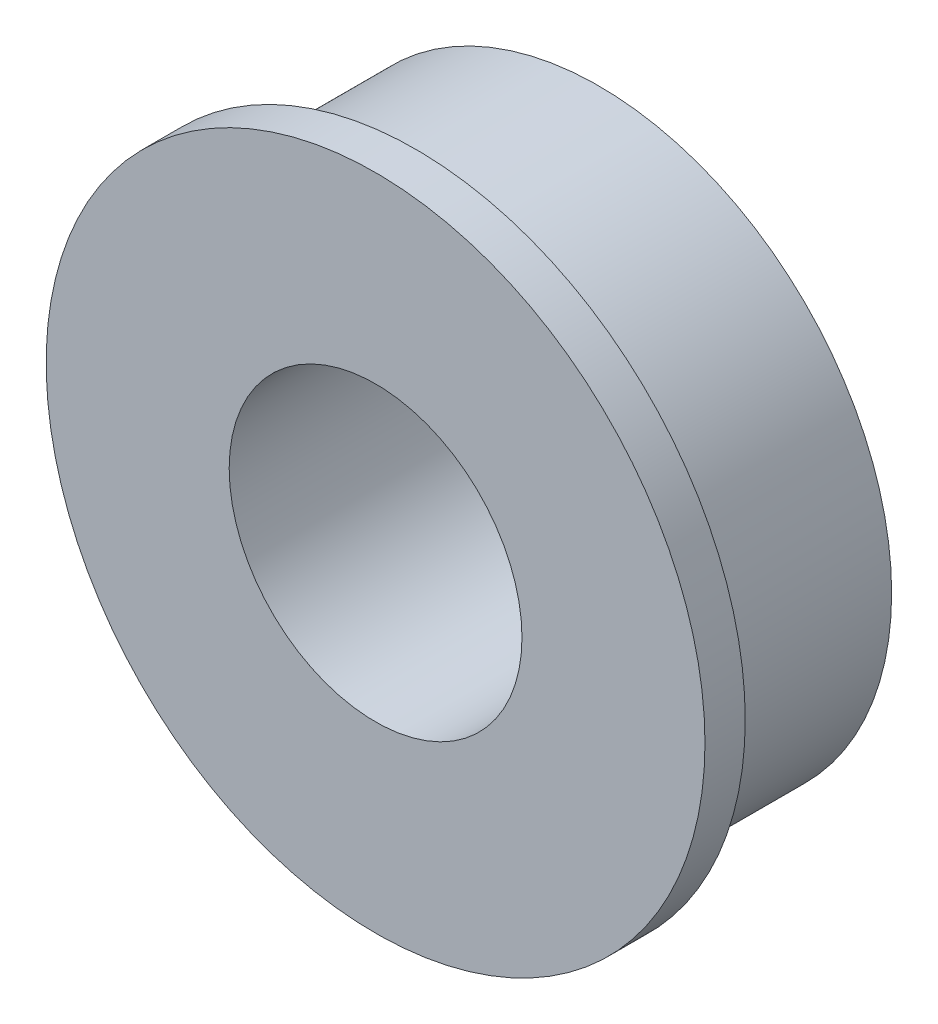
ISO-10303-21;
HEADER;
FILE_DESCRIPTION(('STEP AP214'),'2;1');
FILE_NAME('part.step','',(''),(''),'','','');
FILE_SCHEMA(('AUTOMOTIVE_DESIGN { 1 0 10303 214 1 1 1 1 }'));
ENDSEC;
DATA;
#1=APPLICATION_CONTEXT('core data for automotive mechanical design processes');
#2=APPLICATION_PROTOCOL_DEFINITION('international standard','automotive_design',2000,#1);
#3=PRODUCT_CONTEXT('',#1,'mechanical');
#4=PRODUCT('Part','Part','',(#3));
#5=PRODUCT_RELATED_PRODUCT_CATEGORY('part','',(#4));
#6=PRODUCT_DEFINITION_FORMATION('','',#4);
#7=PRODUCT_DEFINITION_CONTEXT('part definition',#1,'design');
#8=PRODUCT_DEFINITION('design','',#6,#7);
#9=PRODUCT_DEFINITION_SHAPE('','',#8);
#10=(LENGTH_UNIT() NAMED_UNIT(*) SI_UNIT(.MILLI.,.METRE.));
#11=(NAMED_UNIT(*) PLANE_ANGLE_UNIT() SI_UNIT($,.RADIAN.));
#12=(NAMED_UNIT(*) SI_UNIT($,.STERADIAN.) SOLID_ANGLE_UNIT());
#13=UNCERTAINTY_MEASURE_WITH_UNIT(LENGTH_MEASURE(1.E-05),#10,'distance_accuracy_value','');
#14=(GEOMETRIC_REPRESENTATION_CONTEXT(3) GLOBAL_UNCERTAINTY_ASSIGNED_CONTEXT((#13)) GLOBAL_UNIT_ASSIGNED_CONTEXT((#10,
#11,#12)) REPRESENTATION_CONTEXT('',''));
#15=CARTESIAN_POINT('',(0.,0.,0.));
#16=DIRECTION('',(0.,0.,1.));
#17=DIRECTION('',(1.,0.,0.));
#18=AXIS2_PLACEMENT_3D('',#15,#16,#17);
#19=CARTESIAN_POINT('',(0.,0.,0.));
#20=DIRECTION('',(0.,0.,1.));
#21=DIRECTION('',(1.,0.,0.));
#22=AXIS2_PLACEMENT_3D('',#19,#20,#21);
#23=PLANE('',#22);
#24=CARTESIAN_POINT('',(0.,0.,0.));
#25=DIRECTION('',(0.,0.,1.));
#26=DIRECTION('',(1.,0.,0.));
#27=AXIS2_PLACEMENT_3D('',#24,#25,#26);
#28=CIRCLE('',#27,8.);
#29=CARTESIAN_POINT('',(8.,0.,0.));
#30=VERTEX_POINT('',#29);
#31=EDGE_CURVE('E45',#30,#30,#28,.T.);
#32=ORIENTED_EDGE('',*,*,#31,.F.);
#33=EDGE_LOOP('',(#32));
#34=FACE_BOUND('',#33,.T.);
#35=CARTESIAN_POINT('',(0.,0.,0.));
#36=DIRECTION('',(0.,0.,1.));
#37=DIRECTION('',(1.,0.,0.));
#38=AXIS2_PLACEMENT_3D('',#35,#36,#37);
#39=CIRCLE('',#38,4.);
#40=CARTESIAN_POINT('',(4.,0.,0.));
#41=VERTEX_POINT('',#40);
#42=EDGE_CURVE('E54',#41,#41,#39,.T.);
#43=ORIENTED_EDGE('',*,*,#42,.T.);
#44=EDGE_LOOP('',(#43));
#45=FACE_BOUND('',#44,.T.);
#46=ADVANCED_FACE('F41',(#34,#45),#23,.F.);
#47=CARTESIAN_POINT('',(0.,0.,5.));
#48=DIRECTION('',(0.,0.,-1.));
#49=DIRECTION('',(-1.,0.,0.));
#50=AXIS2_PLACEMENT_3D('',#47,#48,#49);
#51=CYLINDRICAL_SURFACE('',#50,8.);
#52=CARTESIAN_POINT('',(0.,0.,5.));
#53=DIRECTION('',(0.,0.,1.));
#54=DIRECTION('',(1.,0.,0.));
#55=AXIS2_PLACEMENT_3D('',#52,#53,#54);
#56=CIRCLE('',#55,8.);
#57=CARTESIAN_POINT('',(8.,0.,5.));
#58=VERTEX_POINT('',#57);
#59=EDGE_CURVE('E10',#58,#58,#56,.T.);
#60=ORIENTED_EDGE('',*,*,#59,.F.);
#61=EDGE_LOOP('',(#60));
#62=FACE_BOUND('',#61,.T.);
#63=ORIENTED_EDGE('',*,*,#31,.T.);
#64=EDGE_LOOP('',(#63));
#65=FACE_BOUND('',#64,.T.);
#66=ADVANCED_FACE('F43',(#62,#65),#51,.T.);
#67=CARTESIAN_POINT('',(0.,0.,5.));
#68=DIRECTION('',(0.,0.,-1.));
#69=DIRECTION('',(-1.,0.,0.));
#70=AXIS2_PLACEMENT_3D('',#67,#68,#69);
#71=CYLINDRICAL_SURFACE('',#70,4.);
#72=ORIENTED_EDGE('',*,*,#42,.F.);
#73=EDGE_LOOP('',(#72));
#74=FACE_BOUND('',#73,.T.);
#75=CARTESIAN_POINT('',(0.,0.,6.1));
#76=DIRECTION('',(0.,0.,1.));
#77=DIRECTION('',(1.,0.,0.));
#78=AXIS2_PLACEMENT_3D('',#75,#76,#77);
#79=CIRCLE('',#78,4.);
#80=CARTESIAN_POINT('',(4.,0.,6.1));
#81=VERTEX_POINT('',#80);
#82=EDGE_CURVE('E64',#81,#81,#79,.T.);
#83=ORIENTED_EDGE('',*,*,#82,.T.);
#84=EDGE_LOOP('',(#83));
#85=FACE_BOUND('',#84,.T.);
#86=ADVANCED_FACE('F72',(#74,#85),#71,.F.);
#87=CARTESIAN_POINT('',(0.,0.,6.1));
#88=DIRECTION('',(0.,0.,1.));
#89=DIRECTION('',(1.,0.,0.));
#90=AXIS2_PLACEMENT_3D('',#87,#88,#89);
#91=PLANE('',#90);
#92=CARTESIAN_POINT('',(0.,0.,6.1));
#93=DIRECTION('',(0.,0.,1.));
#94=DIRECTION('',(1.,0.,0.));
#95=AXIS2_PLACEMENT_3D('',#92,#93,#94);
#96=CIRCLE('',#95,9.);
#97=CARTESIAN_POINT('',(9.,0.,6.1));
#98=VERTEX_POINT('',#97);
#99=EDGE_CURVE('E59',#98,#98,#96,.T.);
#100=ORIENTED_EDGE('',*,*,#99,.T.);
#101=EDGE_LOOP('',(#100));
#102=FACE_BOUND('',#101,.T.);
#103=ORIENTED_EDGE('',*,*,#82,.F.);
#104=EDGE_LOOP('',(#103));
#105=FACE_BOUND('',#104,.T.);
#106=ADVANCED_FACE('F74',(#102,#105),#91,.T.);
#107=CARTESIAN_POINT('',(0.,0.,5.));
#108=DIRECTION('',(0.,0.,1.));
#109=DIRECTION('',(1.,0.,0.));
#110=AXIS2_PLACEMENT_3D('',#107,#108,#109);
#111=PLANE('',#110);
#112=ORIENTED_EDGE('',*,*,#59,.T.);
#113=EDGE_LOOP('',(#112));
#114=FACE_BOUND('',#113,.T.);
#115=CARTESIAN_POINT('',(0.,0.,5.));
#116=DIRECTION('',(0.,0.,1.));
#117=DIRECTION('',(1.,0.,0.));
#118=AXIS2_PLACEMENT_3D('',#115,#116,#117);
#119=CIRCLE('',#118,9.);
#120=CARTESIAN_POINT('',(9.,0.,5.));
#121=VERTEX_POINT('',#120);
#122=EDGE_CURVE('E60',#121,#121,#119,.T.);
#123=ORIENTED_EDGE('',*,*,#122,.F.);
#124=EDGE_LOOP('',(#123));
#125=FACE_BOUND('',#124,.T.);
#126=ADVANCED_FACE('F76',(#114,#125),#111,.F.);
#127=CARTESIAN_POINT('',(0.,0.,6.1));
#128=DIRECTION('',(0.,0.,-1.));
#129=DIRECTION('',(-1.,0.,0.));
#130=AXIS2_PLACEMENT_3D('',#127,#128,#129);
#131=CYLINDRICAL_SURFACE('',#130,9.);
#132=ORIENTED_EDGE('',*,*,#99,.F.);
#133=EDGE_LOOP('',(#132));
#134=FACE_BOUND('',#133,.T.);
#135=ORIENTED_EDGE('',*,*,#122,.T.);
#136=EDGE_LOOP('',(#135));
#137=FACE_BOUND('',#136,.T.);
#138=ADVANCED_FACE('F83',(#134,#137),#131,.T.);
#139=CLOSED_SHELL('',(#46,#66,#86,#106,#126,#138));
#140=MANIFOLD_SOLID_BREP('B2',#139);
#141=ADVANCED_BREP_SHAPE_REPRESENTATION('',(#18,#140),#14);
#142=SHAPE_DEFINITION_REPRESENTATION(#9,#141);
ENDSEC;
END-ISO-10303-21;
